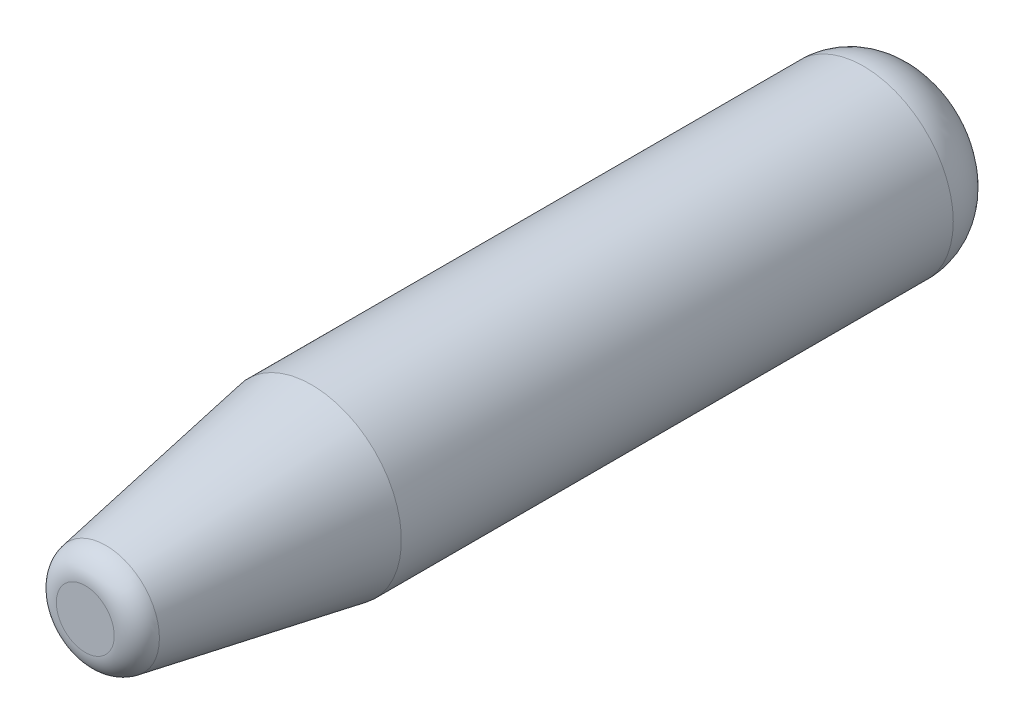
ISO-10303-21;
HEADER;
FILE_DESCRIPTION(('STEP AP214'),'2;1');
FILE_NAME('part.step','',(''),(''),'','','');
FILE_SCHEMA(('AUTOMOTIVE_DESIGN { 1 0 10303 214 1 1 1 1 }'));
ENDSEC;
DATA;
#1=APPLICATION_CONTEXT('core data for automotive mechanical design processes');
#2=APPLICATION_PROTOCOL_DEFINITION('international standard','automotive_design',2000,#1);
#3=PRODUCT_CONTEXT('',#1,'mechanical');
#4=PRODUCT('Part','Part','',(#3));
#5=PRODUCT_RELATED_PRODUCT_CATEGORY('part','',(#4));
#6=PRODUCT_DEFINITION_FORMATION('','',#4);
#7=PRODUCT_DEFINITION_CONTEXT('part definition',#1,'design');
#8=PRODUCT_DEFINITION('design','',#6,#7);
#9=PRODUCT_DEFINITION_SHAPE('','',#8);
#10=(LENGTH_UNIT() NAMED_UNIT(*) SI_UNIT(.MILLI.,.METRE.));
#11=(NAMED_UNIT(*) PLANE_ANGLE_UNIT() SI_UNIT($,.RADIAN.));
#12=(NAMED_UNIT(*) SI_UNIT($,.STERADIAN.) SOLID_ANGLE_UNIT());
#13=UNCERTAINTY_MEASURE_WITH_UNIT(LENGTH_MEASURE(1.E-05),#10,'distance_accuracy_value','');
#14=(GEOMETRIC_REPRESENTATION_CONTEXT(3) GLOBAL_UNCERTAINTY_ASSIGNED_CONTEXT((#13)) GLOBAL_UNIT_ASSIGNED_CONTEXT((#10,
#11,#12)) REPRESENTATION_CONTEXT('',''));
#15=CARTESIAN_POINT('',(0.,0.,0.));
#16=DIRECTION('',(0.,0.,1.));
#17=DIRECTION('',(1.,0.,0.));
#18=AXIS2_PLACEMENT_3D('',#15,#16,#17);
#19=CARTESIAN_POINT('',(0.,0.,2133.6));
#20=DIRECTION('',(0.,0.,-1.));
#21=DIRECTION('',(-1.,0.,0.));
#22=AXIS2_PLACEMENT_3D('',#19,#20,#21);
#23=CYLINDRICAL_SURFACE('',#22,228.6);
#24=CARTESIAN_POINT('',(0.,0.,1557.39776712684));
#25=DIRECTION('',(0.,0.,1.));
#26=DIRECTION('',(1.,0.,0.));
#27=AXIS2_PLACEMENT_3D('',#24,#25,#26);
#28=CIRCLE('',#27,228.6);
#29=CARTESIAN_POINT('',(-228.6,0.,1557.39776712684));
#30=VERTEX_POINT('',#29);
#31=EDGE_CURVE('E45',#30,#30,#28,.F.);
#32=ORIENTED_EDGE('',*,*,#31,.T.);
#33=EDGE_LOOP('',(#32));
#34=FACE_BOUND('',#33,.T.);
#35=CARTESIAN_POINT('',(0.,0.,152.4));
#36=DIRECTION('',(0.,0.,1.));
#37=DIRECTION('',(1.,0.,0.));
#38=AXIS2_PLACEMENT_3D('',#35,#36,#37);
#39=CIRCLE('',#38,228.6);
#40=CARTESIAN_POINT('',(228.6,0.,152.4));
#41=VERTEX_POINT('',#40);
#42=EDGE_CURVE('E54',#41,#41,#39,.T.);
#43=ORIENTED_EDGE('',*,*,#42,.T.);
#44=EDGE_LOOP('',(#43));
#45=FACE_BOUND('',#44,.T.);
#46=ADVANCED_FACE('F34',(#34,#45),#23,.T.);
#47=CARTESIAN_POINT('',(0.,0.,2133.6));
#48=DIRECTION('',(0.,0.,1.));
#49=DIRECTION('',(1.,0.,0.));
#50=AXIS2_PLACEMENT_3D('',#47,#48,#49);
#51=PLANE('',#50);
#52=CARTESIAN_POINT('',(0.,0.,2133.6));
#53=DIRECTION('',(0.,0.,1.));
#54=DIRECTION('',(1.,0.,0.));
#55=AXIS2_PLACEMENT_3D('',#52,#53,#54);
#56=CIRCLE('',#55,73.7171734202417);
#57=CARTESIAN_POINT('',(73.7171734202417,0.,2133.6));
#58=VERTEX_POINT('',#57);
#59=EDGE_CURVE('E41',#58,#58,#56,.T.);
#60=ORIENTED_EDGE('',*,*,#59,.T.);
#61=EDGE_LOOP('',(#60));
#62=FACE_BOUND('',#61,.T.);
#63=ADVANCED_FACE('F69',(#62),#51,.T.);
#64=CARTESIAN_POINT('',(0.,0.,0.));
#65=DIRECTION('',(0.,0.,1.));
#66=DIRECTION('',(1.,0.,0.));
#67=AXIS2_PLACEMENT_3D('',#64,#65,#66);
#68=PLANE('',#67);
#69=CARTESIAN_POINT('',(0.,0.,0.));
#70=DIRECTION('',(0.,0.,1.));
#71=DIRECTION('',(1.,0.,0.));
#72=AXIS2_PLACEMENT_3D('',#69,#70,#71);
#73=CIRCLE('',#72,76.2);
#74=CARTESIAN_POINT('',(76.2,0.,0.));
#75=VERTEX_POINT('',#74);
#76=EDGE_CURVE('E49',#75,#75,#73,.F.);
#77=ORIENTED_EDGE('',*,*,#76,.T.);
#78=EDGE_LOOP('',(#77));
#79=FACE_BOUND('',#78,.T.);
#80=ADVANCED_FACE('F62',(#79),#68,.F.);
#81=CARTESIAN_POINT('',(0.,0.,152.4));
#82=DIRECTION('',(0.,0.,1.));
#83=DIRECTION('',(1.,0.,0.));
#84=AXIS2_PLACEMENT_3D('',#81,#82,#83);
#85=DEGENERATE_TOROIDAL_SURFACE('',#84,76.2,152.4,.T.);
#86=ORIENTED_EDGE('',*,*,#76,.F.);
#87=EDGE_LOOP('',(#86));
#88=FACE_BOUND('',#87,.T.);
#89=ORIENTED_EDGE('',*,*,#42,.F.);
#90=EDGE_LOOP('',(#89));
#91=FACE_BOUND('',#90,.T.);
#92=ADVANCED_FACE('F59',(#88,#91),#85,.T.);
#93=CARTESIAN_POINT('',(0.,0.,2133.6));
#94=DIRECTION('',(0.,0.,-1.));
#95=DIRECTION('',(-1.,0.,0.));
#96=AXIS2_PLACEMENT_3D('',#93,#94,#95);
#97=CONICAL_SURFACE('',#96,126.999999999999,0.174532925199434);
#98=CARTESIAN_POINT('',(0.,0.,2081.12665928185));
#99=DIRECTION('',(0.,0.,1.));
#100=DIRECTION('',(1.,0.,0.));
#101=AXIS2_PLACEMENT_3D('',#98,#99,#100);
#102=CIRCLE('',#101,136.252465736517);
#103=CARTESIAN_POINT('',(-136.252465736517,0.,2081.12665928185));
#104=VERTEX_POINT('',#103);
#105=EDGE_CURVE('E10',#104,#104,#102,.F.);
#106=CARTESIAN_POINT('',(-136.252465736517,0.,2081.12665928185));
#107=CARTESIAN_POINT('',(-137.214419218428,0.,2075.67114998857));
#108=CARTESIAN_POINT('',(-138.176372700339,0.,2070.21564069529));
#109=CARTESIAN_POINT('',(-140.100279664162,0.,2059.30462210872));
#110=CARTESIAN_POINT('',(-141.062233146073,0.,2053.84911281544));
#111=CARTESIAN_POINT('',(-142.986140109896,0.,2042.93809422888));
#112=CARTESIAN_POINT('',(-143.948093591807,0.,2037.4825849356));
#113=CARTESIAN_POINT('',(-145.87200055563,0.,2026.57156634904));
#114=CARTESIAN_POINT('',(-146.833954037541,0.,2021.11605705575));
#115=CARTESIAN_POINT('',(-148.757861001364,0.,2010.20503846919));
#116=CARTESIAN_POINT('',(-149.719814483275,0.,2004.74952917591));
#117=CARTESIAN_POINT('',(-151.643721447097,0.,1993.83851058935));
#118=CARTESIAN_POINT('',(-152.605674929009,0.,1988.38300129607));
#119=CARTESIAN_POINT('',(-154.529581892831,0.,1977.4719827095));
#120=CARTESIAN_POINT('',(-155.491535374743,0.,1972.01647341622));
#121=CARTESIAN_POINT('',(-157.415442338565,0.,1961.10545482966));
#122=CARTESIAN_POINT('',(-158.377395820476,0.,1955.64994553638));
#123=CARTESIAN_POINT('',(-160.301302784299,0.,1944.73892694982));
#124=CARTESIAN_POINT('',(-161.26325626621,0.,1939.28341765653));
#125=CARTESIAN_POINT('',(-163.187163230033,0.,1928.37239906997));
#126=CARTESIAN_POINT('',(-164.149116711944,0.,1922.91688977669));
#127=CARTESIAN_POINT('',(-166.073023675767,0.,1912.00587119013));
#128=CARTESIAN_POINT('',(-167.034977157678,0.,1906.55036189685));
#129=CARTESIAN_POINT('',(-168.958884121501,0.,1895.63934331028));
#130=CARTESIAN_POINT('',(-169.920837603412,0.,1890.183834017));
#131=CARTESIAN_POINT('',(-171.844744567234,0.,1879.27281543044));
#132=CARTESIAN_POINT('',(-172.806698049146,0.,1873.81730613716));
#133=CARTESIAN_POINT('',(-174.730605012968,0.,1862.9062875506));
#134=CARTESIAN_POINT('',(-175.69255849488,0.,1857.45077825731));
#135=CARTESIAN_POINT('',(-177.616465458702,0.,1846.53975967075));
#136=CARTESIAN_POINT('',(-178.578418940613,0.,1841.08425037747));
#137=CARTESIAN_POINT('',(-180.502325904436,0.,1830.17323179091));
#138=CARTESIAN_POINT('',(-181.464279386347,0.,1824.71772249763));
#139=CARTESIAN_POINT('',(-183.38818635017,0.,1813.80670391106));
#140=CARTESIAN_POINT('',(-184.350139832081,0.,1808.35119461778));
#141=CARTESIAN_POINT('',(-186.274046795904,0.,1797.44017603122));
#142=CARTESIAN_POINT('',(-187.236000277815,0.,1791.98466673794));
#143=CARTESIAN_POINT('',(-189.159907241638,0.,1781.07364815137));
#144=CARTESIAN_POINT('',(-190.121860723549,0.,1775.61813885809));
#145=CARTESIAN_POINT('',(-192.045767687371,0.,1764.70712027153));
#146=CARTESIAN_POINT('',(-193.007721169283,0.,1759.25161097825));
#147=CARTESIAN_POINT('',(-194.931628133105,0.,1748.34059239169));
#148=CARTESIAN_POINT('',(-195.893581615017,0.,1742.88508309841));
#149=CARTESIAN_POINT('',(-197.817488578839,0.,1731.97406451184));
#150=CARTESIAN_POINT('',(-198.77944206075,0.,1726.51855521856));
#151=CARTESIAN_POINT('',(-200.703349024573,0.,1715.607536632));
#152=CARTESIAN_POINT('',(-201.665302506484,0.,1710.15202733872));
#153=CARTESIAN_POINT('',(-203.589209470307,0.,1699.24100875215));
#154=CARTESIAN_POINT('',(-204.551162952218,0.,1693.78549945887));
#155=CARTESIAN_POINT('',(-206.475069916041,0.,1682.87448087231));
#156=CARTESIAN_POINT('',(-207.437023397952,0.,1677.41897157903));
#157=CARTESIAN_POINT('',(-209.360930361774,0.,1666.50795299247));
#158=CARTESIAN_POINT('',(-210.322883843686,0.,1661.05244369918));
#159=CARTESIAN_POINT('',(-212.246790807508,0.,1650.14142511262));
#160=CARTESIAN_POINT('',(-213.20874428942,0.,1644.68591581934));
#161=CARTESIAN_POINT('',(-215.132651253242,0.,1633.77489723278));
#162=CARTESIAN_POINT('',(-216.094604735153,0.,1628.3193879395));
#163=CARTESIAN_POINT('',(-218.018511698976,0.,1617.40836935293));
#164=CARTESIAN_POINT('',(-218.980465180887,0.,1611.95286005965));
#165=CARTESIAN_POINT('',(-220.90437214471,0.,1601.04184147309));
#166=CARTESIAN_POINT('',(-221.866325626621,0.,1595.58633217981));
#167=CARTESIAN_POINT('',(-223.790232590444,0.,1584.67531359325));
#168=CARTESIAN_POINT('',(-224.752186072355,0.,1579.21980429996));
#169=CARTESIAN_POINT('',(-226.676093036177,0.,1568.3087857134));
#170=CARTESIAN_POINT('',(-227.638046518089,0.,1562.85327642012));
#171=CARTESIAN_POINT('',(-228.6,0.,1557.39776712684));
#172=B_SPLINE_CURVE_WITH_KNOTS('',3,(#106,#107,#108,#109,#110,#111,#112,#113,#114,#115,#116,
#117,#118,#119,#120,#121,#122,#123,#124,#125,#126,#127,#128,#129,#130,#131,#132,#133,#134,#135,
#136,#137,#138,#139,#140,#141,#142,#143,#144,#145,#146,#147,#148,#149,#150,#151,#152,#153,#154,
#155,#156,#157,#158,#159,#160,#161,#162,#163,#164,#165,#166,#167,#168,#169,#170,#171),
.UNSPECIFIED.,.F.,.F.,(4,2,2,2,2,2,2,2,2,2,2,2,2,2,2,2,2,2,2,2,2,2,2,2,2,2,2,2,2,2,2,2,4),(0.,
16.619007953364,33.2380159067275,49.8570238600915,66.476031813455,83.0950397668187,
99.7140477201823,116.333055673546,132.95206362691,149.571071580273,166.190079533637,
182.809087487001,199.428095440364,216.047103393728,232.666111347092,249.285119300455,
265.904127253819,282.523135207183,299.142143160546,315.76115111391,332.380159067274,
348.999167020638,365.618174974001,382.237182927365,398.856190880729,415.475198834092,
432.094206787456,448.71321474082,465.332222694183,481.951230647547,498.570238600911,
515.189246554274,531.808254507638),.UNSPECIFIED.);
#173=EDGE_CURVE('BSEAM61',#104,#30,#172,.T.);
#174=ORIENTED_EDGE('',*,*,#105,.T.);
#175=ORIENTED_EDGE('',*,*,#31,.F.);
#176=ORIENTED_EDGE('',*,*,#173,.T.);
#177=ORIENTED_EDGE('',*,*,#173,.F.);
#178=EDGE_LOOP('',(#174,#176,#175,#177));
#179=FACE_BOUND('',#178,.T.);
#180=ADVANCED_FACE('F61',(#179),#97,.T.);
#181=CARTESIAN_POINT('',(0.,0.,2070.1));
#182=DIRECTION('',(0.,0.,1.));
#183=DIRECTION('',(1.,0.,0.));
#184=AXIS2_PLACEMENT_3D('',#181,#182,#183);
#185=TOROIDAL_SURFACE('',#184,73.7171734202417,63.5);
#186=ORIENTED_EDGE('',*,*,#105,.F.);
#187=EDGE_LOOP('',(#186));
#188=FACE_BOUND('',#187,.T.);
#189=ORIENTED_EDGE('',*,*,#59,.F.);
#190=EDGE_LOOP('',(#189));
#191=FACE_BOUND('',#190,.T.);
#192=ADVANCED_FACE('F36',(#188,#191),#185,.T.);
#193=CLOSED_SHELL('',(#46,#63,#80,#92,#180,#192));
#194=MANIFOLD_SOLID_BREP('B2',#193);
#195=ADVANCED_BREP_SHAPE_REPRESENTATION('',(#18,#194),#14);
#196=SHAPE_DEFINITION_REPRESENTATION(#9,#195);
ENDSEC;
END-ISO-10303-21;
